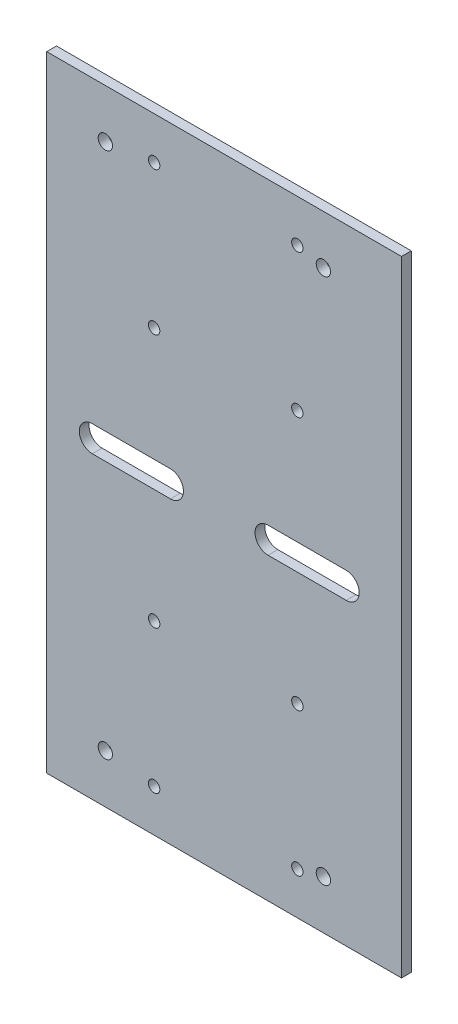
ISO-10303-21;
HEADER;
FILE_DESCRIPTION(('STEP AP214'),'2;1');
FILE_NAME('part.step','',(''),(''),'','','');
FILE_SCHEMA(('AUTOMOTIVE_DESIGN { 1 0 10303 214 1 1 1 1 }'));
ENDSEC;
DATA;
#1=APPLICATION_CONTEXT('core data for automotive mechanical design processes');
#2=APPLICATION_PROTOCOL_DEFINITION('international standard','automotive_design',2000,#1);
#3=PRODUCT_CONTEXT('',#1,'mechanical');
#4=PRODUCT('Part','Part','',(#3));
#5=PRODUCT_RELATED_PRODUCT_CATEGORY('part','',(#4));
#6=PRODUCT_DEFINITION_FORMATION('','',#4);
#7=PRODUCT_DEFINITION_CONTEXT('part definition',#1,'design');
#8=PRODUCT_DEFINITION('design','',#6,#7);
#9=PRODUCT_DEFINITION_SHAPE('','',#8);
#10=(LENGTH_UNIT() NAMED_UNIT(*) SI_UNIT(.MILLI.,.METRE.));
#11=(NAMED_UNIT(*) PLANE_ANGLE_UNIT() SI_UNIT($,.RADIAN.));
#12=(NAMED_UNIT(*) SI_UNIT($,.STERADIAN.) SOLID_ANGLE_UNIT());
#13=UNCERTAINTY_MEASURE_WITH_UNIT(LENGTH_MEASURE(1.E-05),#10,'distance_accuracy_value','');
#14=(GEOMETRIC_REPRESENTATION_CONTEXT(3) GLOBAL_UNCERTAINTY_ASSIGNED_CONTEXT((#13)) GLOBAL_UNIT_ASSIGNED_CONTEXT((#10,
#11,#12)) REPRESENTATION_CONTEXT('',''));
#15=CARTESIAN_POINT('',(0.,0.,0.));
#16=DIRECTION('',(0.,0.,1.));
#17=DIRECTION('',(1.,0.,0.));
#18=AXIS2_PLACEMENT_3D('',#15,#16,#17);
#19=CARTESIAN_POINT('',(0.,0.,3.));
#20=DIRECTION('',(0.,0.,1.));
#21=DIRECTION('',(1.,0.,0.));
#22=AXIS2_PLACEMENT_3D('',#19,#20,#21);
#23=PLANE('',#22);
#24=CARTESIAN_POINT('',(22.,-39.,3.));
#25=DIRECTION('',(0.,0.,1.));
#26=DIRECTION('',(1.,0.,0.));
#27=AXIS2_PLACEMENT_3D('',#24,#25,#26);
#28=CIRCLE('',#27,1.75);
#29=CARTESIAN_POINT('',(23.75,-39.,3.));
#30=VERTEX_POINT('',#29);
#31=EDGE_CURVE('E235',#30,#30,#28,.T.);
#32=ORIENTED_EDGE('',*,*,#31,.F.);
#33=EDGE_LOOP('',(#32));
#34=FACE_BOUND('',#33,.T.);
#35=CARTESIAN_POINT('',(22.,-83.,3.));
#36=DIRECTION('',(0.,0.,1.));
#37=DIRECTION('',(1.,0.,0.));
#38=AXIS2_PLACEMENT_3D('',#35,#36,#37);
#39=CIRCLE('',#38,1.75);
#40=CARTESIAN_POINT('',(23.75,-83.,3.));
#41=VERTEX_POINT('',#40);
#42=EDGE_CURVE('E251',#41,#41,#39,.T.);
#43=ORIENTED_EDGE('',*,*,#42,.F.);
#44=EDGE_LOOP('',(#43));
#45=FACE_BOUND('',#44,.T.);
#46=CARTESIAN_POINT('',(-22.,-39.,3.));
#47=DIRECTION('',(0.,0.,1.));
#48=DIRECTION('',(1.,0.,0.));
#49=AXIS2_PLACEMENT_3D('',#46,#47,#48);
#50=CIRCLE('',#49,1.75);
#51=CARTESIAN_POINT('',(-20.25,-39.,3.));
#52=VERTEX_POINT('',#51);
#53=EDGE_CURVE('E267',#52,#52,#50,.T.);
#54=ORIENTED_EDGE('',*,*,#53,.F.);
#55=EDGE_LOOP('',(#54));
#56=FACE_BOUND('',#55,.T.);
#57=CARTESIAN_POINT('',(-22.,-83.,3.));
#58=DIRECTION('',(0.,0.,1.));
#59=DIRECTION('',(1.,0.,0.));
#60=AXIS2_PLACEMENT_3D('',#57,#58,#59);
#61=CIRCLE('',#60,1.75);
#62=CARTESIAN_POINT('',(-20.25,-83.,3.));
#63=VERTEX_POINT('',#62);
#64=EDGE_CURVE('E283',#63,#63,#61,.T.);
#65=ORIENTED_EDGE('',*,*,#64,.F.);
#66=EDGE_LOOP('',(#65));
#67=FACE_BOUND('',#66,.T.);
#68=CARTESIAN_POINT('',(30.,-81.,3.));
#69=DIRECTION('',(0.,0.,1.));
#70=DIRECTION('',(1.,0.,0.));
#71=AXIS2_PLACEMENT_3D('',#68,#69,#70);
#72=CIRCLE('',#71,2.2);
#73=CARTESIAN_POINT('',(32.2,-81.,3.));
#74=VERTEX_POINT('',#73);
#75=EDGE_CURVE('E299',#74,#74,#72,.T.);
#76=ORIENTED_EDGE('',*,*,#75,.F.);
#77=EDGE_LOOP('',(#76));
#78=FACE_BOUND('',#77,.T.);
#79=CARTESIAN_POINT('',(-37.,-81.,3.));
#80=DIRECTION('',(0.,0.,1.));
#81=DIRECTION('',(1.,0.,0.));
#82=AXIS2_PLACEMENT_3D('',#79,#80,#81);
#83=CIRCLE('',#82,2.2);
#84=CARTESIAN_POINT('',(-34.8,-81.,3.));
#85=VERTEX_POINT('',#84);
#86=EDGE_CURVE('E315',#85,#85,#83,.T.);
#87=ORIENTED_EDGE('',*,*,#86,.F.);
#88=EDGE_LOOP('',(#87));
#89=FACE_BOUND('',#88,.T.);
#90=DIRECTION('',(0.,-1.,0.));
#91=VECTOR('',#90,1.);
#92=CARTESIAN_POINT('',(-55.,96.,3.));
#93=LINE('',#92,#91);
#94=CARTESIAN_POINT('',(-55.,96.,3.));
#95=VERTEX_POINT('',#94);
#96=CARTESIAN_POINT('',(-55.,-96.,3.));
#97=VERTEX_POINT('',#96);
#98=EDGE_CURVE('E323',#95,#97,#93,.T.);
#99=ORIENTED_EDGE('',*,*,#98,.T.);
#100=DIRECTION('',(1.,0.,0.));
#101=VECTOR('',#100,1.);
#102=CARTESIAN_POINT('',(-55.,-96.,3.));
#103=LINE('',#102,#101);
#104=CARTESIAN_POINT('',(54.,-96.,3.));
#105=VERTEX_POINT('',#104);
#106=EDGE_CURVE('E327',#97,#105,#103,.T.);
#107=ORIENTED_EDGE('',*,*,#106,.T.);
#108=DIRECTION('',(0.,1.,0.));
#109=VECTOR('',#108,1.);
#110=CARTESIAN_POINT('',(54.,-96.,3.));
#111=LINE('',#110,#109);
#112=CARTESIAN_POINT('',(54.,96.,3.));
#113=VERTEX_POINT('',#112);
#114=EDGE_CURVE('E331',#105,#113,#111,.T.);
#115=ORIENTED_EDGE('',*,*,#114,.T.);
#116=DIRECTION('',(-1.,0.,0.));
#117=VECTOR('',#116,1.);
#118=CARTESIAN_POINT('',(54.,96.,3.));
#119=LINE('',#118,#117);
#120=EDGE_CURVE('E334',#113,#95,#119,.T.);
#121=ORIENTED_EDGE('',*,*,#120,.T.);
#122=EDGE_LOOP('',(#99,#107,#115,#121));
#123=FACE_BOUND('',#122,.T.);
#124=CARTESIAN_POINT('',(-37.,81.,3.));
#125=DIRECTION('',(0.,0.,1.));
#126=DIRECTION('',(1.,0.,0.));
#127=AXIS2_PLACEMENT_3D('',#124,#125,#126);
#128=CIRCLE('',#127,2.2);
#129=CARTESIAN_POINT('',(-34.8,81.,3.));
#130=VERTEX_POINT('',#129);
#131=EDGE_CURVE('E307',#130,#130,#128,.T.);
#132=ORIENTED_EDGE('',*,*,#131,.F.);
#133=EDGE_LOOP('',(#132));
#134=FACE_BOUND('',#133,.T.);
#135=CARTESIAN_POINT('',(30.,81.,3.));
#136=DIRECTION('',(0.,0.,1.));
#137=DIRECTION('',(1.,0.,0.));
#138=AXIS2_PLACEMENT_3D('',#135,#136,#137);
#139=CIRCLE('',#138,2.2);
#140=CARTESIAN_POINT('',(32.2,81.,3.));
#141=VERTEX_POINT('',#140);
#142=EDGE_CURVE('E291',#141,#141,#139,.T.);
#143=ORIENTED_EDGE('',*,*,#142,.F.);
#144=EDGE_LOOP('',(#143));
#145=FACE_BOUND('',#144,.T.);
#146=CARTESIAN_POINT('',(-22.,39.,3.));
#147=DIRECTION('',(0.,0.,1.));
#148=DIRECTION('',(1.,0.,0.));
#149=AXIS2_PLACEMENT_3D('',#146,#147,#148);
#150=CIRCLE('',#149,1.75);
#151=CARTESIAN_POINT('',(-20.25,39.,3.));
#152=VERTEX_POINT('',#151);
#153=EDGE_CURVE('E275',#152,#152,#150,.T.);
#154=ORIENTED_EDGE('',*,*,#153,.F.);
#155=EDGE_LOOP('',(#154));
#156=FACE_BOUND('',#155,.T.);
#157=CARTESIAN_POINT('',(-22.,83.,3.));
#158=DIRECTION('',(0.,0.,1.));
#159=DIRECTION('',(1.,0.,0.));
#160=AXIS2_PLACEMENT_3D('',#157,#158,#159);
#161=CIRCLE('',#160,1.75);
#162=CARTESIAN_POINT('',(-20.25,83.,3.));
#163=VERTEX_POINT('',#162);
#164=EDGE_CURVE('E259',#163,#163,#161,.T.);
#165=ORIENTED_EDGE('',*,*,#164,.F.);
#166=EDGE_LOOP('',(#165));
#167=FACE_BOUND('',#166,.T.);
#168=CARTESIAN_POINT('',(22.,39.,3.));
#169=DIRECTION('',(0.,0.,1.));
#170=DIRECTION('',(1.,0.,0.));
#171=AXIS2_PLACEMENT_3D('',#168,#169,#170);
#172=CIRCLE('',#171,1.75);
#173=CARTESIAN_POINT('',(23.75,39.,3.));
#174=VERTEX_POINT('',#173);
#175=EDGE_CURVE('E243',#174,#174,#172,.T.);
#176=ORIENTED_EDGE('',*,*,#175,.F.);
#177=EDGE_LOOP('',(#176));
#178=FACE_BOUND('',#177,.T.);
#179=CARTESIAN_POINT('',(22.,83.,3.));
#180=DIRECTION('',(0.,0.,1.));
#181=DIRECTION('',(1.,0.,0.));
#182=AXIS2_PLACEMENT_3D('',#179,#180,#181);
#183=CIRCLE('',#182,1.75);
#184=CARTESIAN_POINT('',(23.75,83.,3.));
#185=VERTEX_POINT('',#184);
#186=EDGE_CURVE('E227',#185,#185,#183,.T.);
#187=ORIENTED_EDGE('',*,*,#186,.F.);
#188=EDGE_LOOP('',(#187));
#189=FACE_BOUND('',#188,.T.);
#190=DIRECTION('',(1.,0.,0.));
#191=VECTOR('',#190,1.);
#192=CARTESIAN_POINT('',(-41.,-4.,3.));
#193=LINE('',#192,#191);
#194=CARTESIAN_POINT('',(-41.,-4.,3.));
#195=VERTEX_POINT('',#194);
#196=CARTESIAN_POINT('',(-17.,-4.,3.));
#197=VERTEX_POINT('',#196);
#198=EDGE_CURVE('E187',#195,#197,#193,.T.);
#199=ORIENTED_EDGE('',*,*,#198,.F.);
#200=CARTESIAN_POINT('',(-41.,0.,3.));
#201=DIRECTION('',(0.,0.,1.));
#202=DIRECTION('',(1.,0.,0.));
#203=AXIS2_PLACEMENT_3D('',#200,#201,#202);
#204=CIRCLE('',#203,4.);
#205=CARTESIAN_POINT('',(-41.,4.,3.));
#206=VERTEX_POINT('',#205);
#207=EDGE_CURVE('E185',#206,#195,#204,.T.);
#208=ORIENTED_EDGE('',*,*,#207,.F.);
#209=DIRECTION('',(-1.,0.,0.));
#210=VECTOR('',#209,1.);
#211=CARTESIAN_POINT('',(-17.,4.,3.));
#212=LINE('',#211,#210);
#213=CARTESIAN_POINT('',(-17.,4.,3.));
#214=VERTEX_POINT('',#213);
#215=EDGE_CURVE('E195',#214,#206,#212,.T.);
#216=ORIENTED_EDGE('',*,*,#215,.F.);
#217=CARTESIAN_POINT('',(-17.,0.,3.));
#218=DIRECTION('',(0.,0.,1.));
#219=DIRECTION('',(1.,0.,0.));
#220=AXIS2_PLACEMENT_3D('',#217,#218,#219);
#221=CIRCLE('',#220,4.);
#222=EDGE_CURVE('E191',#197,#214,#221,.T.);
#223=ORIENTED_EDGE('',*,*,#222,.F.);
#224=EDGE_LOOP('',(#199,#208,#216,#223));
#225=FACE_BOUND('',#224,.T.);
#226=DIRECTION('',(1.,0.,0.));
#227=VECTOR('',#226,1.);
#228=CARTESIAN_POINT('',(13.,-4.,3.));
#229=LINE('',#228,#227);
#230=CARTESIAN_POINT('',(13.,-4.,3.));
#231=VERTEX_POINT('',#230);
#232=CARTESIAN_POINT('',(37.,-4.,3.));
#233=VERTEX_POINT('',#232);
#234=EDGE_CURVE('E144',#231,#233,#229,.T.);
#235=ORIENTED_EDGE('',*,*,#234,.F.);
#236=CARTESIAN_POINT('',(13.,0.,3.));
#237=DIRECTION('',(0.,0.,1.));
#238=DIRECTION('',(1.,0.,0.));
#239=AXIS2_PLACEMENT_3D('',#236,#237,#238);
#240=CIRCLE('',#239,4.);
#241=CARTESIAN_POINT('',(13.,4.,3.));
#242=VERTEX_POINT('',#241);
#243=EDGE_CURVE('E135',#242,#231,#240,.T.);
#244=ORIENTED_EDGE('',*,*,#243,.F.);
#245=DIRECTION('',(-1.,0.,0.));
#246=VECTOR('',#245,1.);
#247=CARTESIAN_POINT('',(37.,4.,3.));
#248=LINE('',#247,#246);
#249=CARTESIAN_POINT('',(37.,4.,3.));
#250=VERTEX_POINT('',#249);
#251=EDGE_CURVE('E163',#250,#242,#248,.T.);
#252=ORIENTED_EDGE('',*,*,#251,.F.);
#253=CARTESIAN_POINT('',(37.,0.,3.));
#254=DIRECTION('',(0.,0.,1.));
#255=DIRECTION('',(1.,0.,0.));
#256=AXIS2_PLACEMENT_3D('',#253,#254,#255);
#257=CIRCLE('',#256,4.);
#258=EDGE_CURVE('E157',#233,#250,#257,.T.);
#259=ORIENTED_EDGE('',*,*,#258,.F.);
#260=EDGE_LOOP('',(#235,#244,#252,#259));
#261=FACE_BOUND('',#260,.T.);
#262=ADVANCED_FACE('F45',(#34,#45,#56,#67,#78,#89,#123,#134,#145,#156,#167,#178,#189,#225,#261),
#23,.T.);
#263=CARTESIAN_POINT('',(0.,0.,0.));
#264=DIRECTION('',(0.,0.,1.));
#265=DIRECTION('',(1.,0.,0.));
#266=AXIS2_PLACEMENT_3D('',#263,#264,#265);
#267=PLANE('',#266);
#268=CARTESIAN_POINT('',(-41.,0.,0.));
#269=DIRECTION('',(0.,0.,1.));
#270=DIRECTION('',(1.,0.,0.));
#271=AXIS2_PLACEMENT_3D('',#268,#269,#270);
#272=CIRCLE('',#271,4.);
#273=CARTESIAN_POINT('',(-41.,4.,0.));
#274=VERTEX_POINT('',#273);
#275=CARTESIAN_POINT('',(-41.,-4.,0.));
#276=VERTEX_POINT('',#275);
#277=EDGE_CURVE('E153',#274,#276,#272,.T.);
#278=ORIENTED_EDGE('',*,*,#277,.T.);
#279=DIRECTION('',(1.,0.,0.));
#280=VECTOR('',#279,1.);
#281=CARTESIAN_POINT('',(-41.,-4.,0.));
#282=LINE('',#281,#280);
#283=CARTESIAN_POINT('',(-17.,-4.,0.));
#284=VERTEX_POINT('',#283);
#285=EDGE_CURVE('E202',#276,#284,#282,.T.);
#286=ORIENTED_EDGE('',*,*,#285,.T.);
#287=CARTESIAN_POINT('',(-17.,0.,0.));
#288=DIRECTION('',(0.,0.,1.));
#289=DIRECTION('',(1.,0.,0.));
#290=AXIS2_PLACEMENT_3D('',#287,#288,#289);
#291=CIRCLE('',#290,4.);
#292=CARTESIAN_POINT('',(-17.,4.,0.));
#293=VERTEX_POINT('',#292);
#294=EDGE_CURVE('E206',#284,#293,#291,.T.);
#295=ORIENTED_EDGE('',*,*,#294,.T.);
#296=DIRECTION('',(-1.,0.,0.));
#297=VECTOR('',#296,1.);
#298=CARTESIAN_POINT('',(-17.,4.,0.));
#299=LINE('',#298,#297);
#300=EDGE_CURVE('E188',#293,#274,#299,.T.);
#301=ORIENTED_EDGE('',*,*,#300,.T.);
#302=EDGE_LOOP('',(#278,#286,#295,#301));
#303=FACE_BOUND('',#302,.T.);
#304=DIRECTION('',(0.,-1.,0.));
#305=VECTOR('',#304,1.);
#306=CARTESIAN_POINT('',(-55.,96.,0.));
#307=LINE('',#306,#305);
#308=CARTESIAN_POINT('',(-55.,96.,0.));
#309=VERTEX_POINT('',#308);
#310=CARTESIAN_POINT('',(-55.,-96.,0.));
#311=VERTEX_POINT('',#310);
#312=EDGE_CURVE('E319',#309,#311,#307,.T.);
#313=ORIENTED_EDGE('',*,*,#312,.F.);
#314=DIRECTION('',(-1.,0.,0.));
#315=VECTOR('',#314,1.);
#316=CARTESIAN_POINT('',(54.,96.,0.));
#317=LINE('',#316,#315);
#318=CARTESIAN_POINT('',(54.,96.,0.));
#319=VERTEX_POINT('',#318);
#320=EDGE_CURVE('E328',#319,#309,#317,.T.);
#321=ORIENTED_EDGE('',*,*,#320,.F.);
#322=DIRECTION('',(0.,1.,0.));
#323=VECTOR('',#322,1.);
#324=CARTESIAN_POINT('',(54.,-96.,0.));
#325=LINE('',#324,#323);
#326=CARTESIAN_POINT('',(54.,-96.,0.));
#327=VERTEX_POINT('',#326);
#328=EDGE_CURVE('E344',#327,#319,#325,.T.);
#329=ORIENTED_EDGE('',*,*,#328,.F.);
#330=DIRECTION('',(1.,0.,0.));
#331=VECTOR('',#330,1.);
#332=CARTESIAN_POINT('',(-55.,-96.,0.));
#333=LINE('',#332,#331);
#334=EDGE_CURVE('E341',#311,#327,#333,.T.);
#335=ORIENTED_EDGE('',*,*,#334,.F.);
#336=EDGE_LOOP('',(#313,#321,#329,#335));
#337=FACE_BOUND('',#336,.T.);
#338=CARTESIAN_POINT('',(-37.,-81.,0.));
#339=DIRECTION('',(0.,0.,1.));
#340=DIRECTION('',(1.,0.,0.));
#341=AXIS2_PLACEMENT_3D('',#338,#339,#340);
#342=CIRCLE('',#341,2.2);
#343=CARTESIAN_POINT('',(-34.8,-81.,0.));
#344=VERTEX_POINT('',#343);
#345=EDGE_CURVE('E311',#344,#344,#342,.T.);
#346=ORIENTED_EDGE('',*,*,#345,.T.);
#347=EDGE_LOOP('',(#346));
#348=FACE_BOUND('',#347,.T.);
#349=CARTESIAN_POINT('',(-37.,81.,0.));
#350=DIRECTION('',(0.,0.,1.));
#351=DIRECTION('',(1.,0.,0.));
#352=AXIS2_PLACEMENT_3D('',#349,#350,#351);
#353=CIRCLE('',#352,2.2);
#354=CARTESIAN_POINT('',(-34.8,81.,0.));
#355=VERTEX_POINT('',#354);
#356=EDGE_CURVE('E303',#355,#355,#353,.T.);
#357=ORIENTED_EDGE('',*,*,#356,.T.);
#358=EDGE_LOOP('',(#357));
#359=FACE_BOUND('',#358,.T.);
#360=CARTESIAN_POINT('',(30.,-81.,0.));
#361=DIRECTION('',(0.,0.,1.));
#362=DIRECTION('',(1.,0.,0.));
#363=AXIS2_PLACEMENT_3D('',#360,#361,#362);
#364=CIRCLE('',#363,2.2);
#365=CARTESIAN_POINT('',(32.2,-81.,0.));
#366=VERTEX_POINT('',#365);
#367=EDGE_CURVE('E295',#366,#366,#364,.T.);
#368=ORIENTED_EDGE('',*,*,#367,.T.);
#369=EDGE_LOOP('',(#368));
#370=FACE_BOUND('',#369,.T.);
#371=CARTESIAN_POINT('',(30.,81.,0.));
#372=DIRECTION('',(0.,0.,1.));
#373=DIRECTION('',(1.,0.,0.));
#374=AXIS2_PLACEMENT_3D('',#371,#372,#373);
#375=CIRCLE('',#374,2.2);
#376=CARTESIAN_POINT('',(32.2,81.,0.));
#377=VERTEX_POINT('',#376);
#378=EDGE_CURVE('E287',#377,#377,#375,.T.);
#379=ORIENTED_EDGE('',*,*,#378,.T.);
#380=EDGE_LOOP('',(#379));
#381=FACE_BOUND('',#380,.T.);
#382=CARTESIAN_POINT('',(-22.,-83.,0.));
#383=DIRECTION('',(0.,0.,1.));
#384=DIRECTION('',(1.,0.,0.));
#385=AXIS2_PLACEMENT_3D('',#382,#383,#384);
#386=CIRCLE('',#385,1.75);
#387=CARTESIAN_POINT('',(-20.25,-83.,0.));
#388=VERTEX_POINT('',#387);
#389=EDGE_CURVE('E279',#388,#388,#386,.T.);
#390=ORIENTED_EDGE('',*,*,#389,.T.);
#391=EDGE_LOOP('',(#390));
#392=FACE_BOUND('',#391,.T.);
#393=CARTESIAN_POINT('',(-22.,39.,0.));
#394=DIRECTION('',(0.,0.,1.));
#395=DIRECTION('',(1.,0.,0.));
#396=AXIS2_PLACEMENT_3D('',#393,#394,#395);
#397=CIRCLE('',#396,1.75);
#398=CARTESIAN_POINT('',(-20.25,39.,0.));
#399=VERTEX_POINT('',#398);
#400=EDGE_CURVE('E271',#399,#399,#397,.T.);
#401=ORIENTED_EDGE('',*,*,#400,.T.);
#402=EDGE_LOOP('',(#401));
#403=FACE_BOUND('',#402,.T.);
#404=CARTESIAN_POINT('',(-22.,-39.,0.));
#405=DIRECTION('',(0.,0.,1.));
#406=DIRECTION('',(1.,0.,0.));
#407=AXIS2_PLACEMENT_3D('',#404,#405,#406);
#408=CIRCLE('',#407,1.75);
#409=CARTESIAN_POINT('',(-20.25,-39.,0.));
#410=VERTEX_POINT('',#409);
#411=EDGE_CURVE('E263',#410,#410,#408,.T.);
#412=ORIENTED_EDGE('',*,*,#411,.T.);
#413=EDGE_LOOP('',(#412));
#414=FACE_BOUND('',#413,.T.);
#415=CARTESIAN_POINT('',(-22.,83.,0.));
#416=DIRECTION('',(0.,0.,1.));
#417=DIRECTION('',(1.,0.,0.));
#418=AXIS2_PLACEMENT_3D('',#415,#416,#417);
#419=CIRCLE('',#418,1.75);
#420=CARTESIAN_POINT('',(-20.25,83.,0.));
#421=VERTEX_POINT('',#420);
#422=EDGE_CURVE('E255',#421,#421,#419,.T.);
#423=ORIENTED_EDGE('',*,*,#422,.T.);
#424=EDGE_LOOP('',(#423));
#425=FACE_BOUND('',#424,.T.);
#426=CARTESIAN_POINT('',(22.,-83.,0.));
#427=DIRECTION('',(0.,0.,1.));
#428=DIRECTION('',(1.,0.,0.));
#429=AXIS2_PLACEMENT_3D('',#426,#427,#428);
#430=CIRCLE('',#429,1.75);
#431=CARTESIAN_POINT('',(23.75,-83.,0.));
#432=VERTEX_POINT('',#431);
#433=EDGE_CURVE('E247',#432,#432,#430,.T.);
#434=ORIENTED_EDGE('',*,*,#433,.T.);
#435=EDGE_LOOP('',(#434));
#436=FACE_BOUND('',#435,.T.);
#437=CARTESIAN_POINT('',(22.,39.,0.));
#438=DIRECTION('',(0.,0.,1.));
#439=DIRECTION('',(1.,0.,0.));
#440=AXIS2_PLACEMENT_3D('',#437,#438,#439);
#441=CIRCLE('',#440,1.75);
#442=CARTESIAN_POINT('',(23.75,39.,0.));
#443=VERTEX_POINT('',#442);
#444=EDGE_CURVE('E239',#443,#443,#441,.T.);
#445=ORIENTED_EDGE('',*,*,#444,.T.);
#446=EDGE_LOOP('',(#445));
#447=FACE_BOUND('',#446,.T.);
#448=CARTESIAN_POINT('',(22.,-39.,0.));
#449=DIRECTION('',(0.,0.,1.));
#450=DIRECTION('',(1.,0.,0.));
#451=AXIS2_PLACEMENT_3D('',#448,#449,#450);
#452=CIRCLE('',#451,1.75);
#453=CARTESIAN_POINT('',(23.75,-39.,0.));
#454=VERTEX_POINT('',#453);
#455=EDGE_CURVE('E231',#454,#454,#452,.T.);
#456=ORIENTED_EDGE('',*,*,#455,.T.);
#457=EDGE_LOOP('',(#456));
#458=FACE_BOUND('',#457,.T.);
#459=CARTESIAN_POINT('',(22.,83.,0.));
#460=DIRECTION('',(0.,0.,1.));
#461=DIRECTION('',(1.,0.,0.));
#462=AXIS2_PLACEMENT_3D('',#459,#460,#461);
#463=CIRCLE('',#462,1.75);
#464=CARTESIAN_POINT('',(23.75,83.,0.));
#465=VERTEX_POINT('',#464);
#466=EDGE_CURVE('E226',#465,#465,#463,.T.);
#467=ORIENTED_EDGE('',*,*,#466,.T.);
#468=EDGE_LOOP('',(#467));
#469=FACE_BOUND('',#468,.T.);
#470=CARTESIAN_POINT('',(13.,0.,0.));
#471=DIRECTION('',(0.,0.,1.));
#472=DIRECTION('',(1.,0.,0.));
#473=AXIS2_PLACEMENT_3D('',#470,#471,#472);
#474=CIRCLE('',#473,4.);
#475=CARTESIAN_POINT('',(13.,4.,0.));
#476=VERTEX_POINT('',#475);
#477=CARTESIAN_POINT('',(13.,-4.,0.));
#478=VERTEX_POINT('',#477);
#479=EDGE_CURVE('E69',#476,#478,#474,.T.);
#480=ORIENTED_EDGE('',*,*,#479,.T.);
#481=DIRECTION('',(1.,0.,0.));
#482=VECTOR('',#481,1.);
#483=CARTESIAN_POINT('',(13.,-4.,0.));
#484=LINE('',#483,#482);
#485=CARTESIAN_POINT('',(37.,-4.,0.));
#486=VERTEX_POINT('',#485);
#487=EDGE_CURVE('E151',#478,#486,#484,.T.);
#488=ORIENTED_EDGE('',*,*,#487,.T.);
#489=CARTESIAN_POINT('',(37.,0.,0.));
#490=DIRECTION('',(0.,0.,1.));
#491=DIRECTION('',(1.,0.,0.));
#492=AXIS2_PLACEMENT_3D('',#489,#490,#491);
#493=CIRCLE('',#492,4.);
#494=CARTESIAN_POINT('',(37.,4.,0.));
#495=VERTEX_POINT('',#494);
#496=EDGE_CURVE('E172',#486,#495,#493,.T.);
#497=ORIENTED_EDGE('',*,*,#496,.T.);
#498=DIRECTION('',(-1.,0.,0.));
#499=VECTOR('',#498,1.);
#500=CARTESIAN_POINT('',(37.,4.,0.));
#501=LINE('',#500,#499);
#502=EDGE_CURVE('E145',#495,#476,#501,.T.);
#503=ORIENTED_EDGE('',*,*,#502,.T.);
#504=EDGE_LOOP('',(#480,#488,#497,#503));
#505=FACE_BOUND('',#504,.T.);
#506=ADVANCED_FACE('F366',(#303,#337,#348,#359,#370,#381,#392,#403,#414,#425,#436,#447,#458,
#469,#505),#267,.F.);
#507=CARTESIAN_POINT('',(-55.,96.,3.));
#508=DIRECTION('',(1.,0.,0.));
#509=DIRECTION('',(0.,0.,-1.));
#510=AXIS2_PLACEMENT_3D('',#507,#508,#509);
#511=PLANE('',#510);
#512=ORIENTED_EDGE('',*,*,#312,.T.);
#513=DIRECTION('',(0.,0.,-1.));
#514=VECTOR('',#513,1.);
#515=CARTESIAN_POINT('',(-55.,-96.,3.));
#516=LINE('',#515,#514);
#517=EDGE_CURVE('E11',#97,#311,#516,.T.);
#518=ORIENTED_EDGE('',*,*,#517,.F.);
#519=ORIENTED_EDGE('',*,*,#98,.F.);
#520=DIRECTION('',(0.,0.,-1.));
#521=VECTOR('',#520,1.);
#522=CARTESIAN_POINT('',(-55.,96.,3.));
#523=LINE('',#522,#521);
#524=EDGE_CURVE('E337',#95,#309,#523,.T.);
#525=ORIENTED_EDGE('',*,*,#524,.T.);
#526=EDGE_LOOP('',(#512,#518,#519,#525));
#527=FACE_BOUND('',#526,.T.);
#528=ADVANCED_FACE('F47',(#527),#511,.F.);
#529=CARTESIAN_POINT('',(-55.,-96.,3.));
#530=DIRECTION('',(0.,1.,0.));
#531=DIRECTION('',(0.,0.,1.));
#532=AXIS2_PLACEMENT_3D('',#529,#530,#531);
#533=PLANE('',#532);
#534=ORIENTED_EDGE('',*,*,#334,.T.);
#535=DIRECTION('',(0.,0.,-1.));
#536=VECTOR('',#535,1.);
#537=CARTESIAN_POINT('',(54.,-96.,3.));
#538=LINE('',#537,#536);
#539=EDGE_CURVE('E54',#105,#327,#538,.T.);
#540=ORIENTED_EDGE('',*,*,#539,.F.);
#541=ORIENTED_EDGE('',*,*,#106,.F.);
#542=ORIENTED_EDGE('',*,*,#517,.T.);
#543=EDGE_LOOP('',(#534,#540,#541,#542));
#544=FACE_BOUND('',#543,.T.);
#545=ADVANCED_FACE('F377',(#544),#533,.F.);
#546=CARTESIAN_POINT('',(54.,-96.,3.));
#547=DIRECTION('',(-1.,0.,0.));
#548=DIRECTION('',(0.,0.,1.));
#549=AXIS2_PLACEMENT_3D('',#546,#547,#548);
#550=PLANE('',#549);
#551=ORIENTED_EDGE('',*,*,#328,.T.);
#552=DIRECTION('',(0.,0.,-1.));
#553=VECTOR('',#552,1.);
#554=CARTESIAN_POINT('',(54.,96.,3.));
#555=LINE('',#554,#553);
#556=EDGE_CURVE('E351',#113,#319,#555,.T.);
#557=ORIENTED_EDGE('',*,*,#556,.F.);
#558=ORIENTED_EDGE('',*,*,#114,.F.);
#559=ORIENTED_EDGE('',*,*,#539,.T.);
#560=EDGE_LOOP('',(#551,#557,#558,#559));
#561=FACE_BOUND('',#560,.T.);
#562=ADVANCED_FACE('F360',(#561),#550,.F.);
#563=CARTESIAN_POINT('',(54.,96.,3.));
#564=DIRECTION('',(0.,-1.,0.));
#565=DIRECTION('',(0.,0.,-1.));
#566=AXIS2_PLACEMENT_3D('',#563,#564,#565);
#567=PLANE('',#566);
#568=ORIENTED_EDGE('',*,*,#320,.T.);
#569=ORIENTED_EDGE('',*,*,#524,.F.);
#570=ORIENTED_EDGE('',*,*,#120,.F.);
#571=ORIENTED_EDGE('',*,*,#556,.T.);
#572=EDGE_LOOP('',(#568,#569,#570,#571));
#573=FACE_BOUND('',#572,.T.);
#574=ADVANCED_FACE('F370',(#573),#567,.F.);
#575=CARTESIAN_POINT('',(-37.,-81.,3.));
#576=DIRECTION('',(0.,0.,-1.));
#577=DIRECTION('',(-1.,0.,0.));
#578=AXIS2_PLACEMENT_3D('',#575,#576,#577);
#579=CYLINDRICAL_SURFACE('',#578,2.2);
#580=ORIENTED_EDGE('',*,*,#86,.T.);
#581=EDGE_LOOP('',(#580));
#582=FACE_BOUND('',#581,.T.);
#583=ORIENTED_EDGE('',*,*,#345,.F.);
#584=EDGE_LOOP('',(#583));
#585=FACE_BOUND('',#584,.T.);
#586=ADVANCED_FACE('F393',(#582,#585),#579,.F.);
#587=CARTESIAN_POINT('',(-37.,81.,3.));
#588=DIRECTION('',(0.,0.,-1.));
#589=DIRECTION('',(-1.,0.,0.));
#590=AXIS2_PLACEMENT_3D('',#587,#588,#589);
#591=CYLINDRICAL_SURFACE('',#590,2.2);
#592=ORIENTED_EDGE('',*,*,#131,.T.);
#593=EDGE_LOOP('',(#592));
#594=FACE_BOUND('',#593,.T.);
#595=ORIENTED_EDGE('',*,*,#356,.F.);
#596=EDGE_LOOP('',(#595));
#597=FACE_BOUND('',#596,.T.);
#598=ADVANCED_FACE('F399',(#594,#597),#591,.F.);
#599=CARTESIAN_POINT('',(30.,-81.,3.));
#600=DIRECTION('',(0.,0.,-1.));
#601=DIRECTION('',(-1.,0.,0.));
#602=AXIS2_PLACEMENT_3D('',#599,#600,#601);
#603=CYLINDRICAL_SURFACE('',#602,2.2);
#604=ORIENTED_EDGE('',*,*,#75,.T.);
#605=EDGE_LOOP('',(#604));
#606=FACE_BOUND('',#605,.T.);
#607=ORIENTED_EDGE('',*,*,#367,.F.);
#608=EDGE_LOOP('',(#607));
#609=FACE_BOUND('',#608,.T.);
#610=ADVANCED_FACE('F403',(#606,#609),#603,.F.);
#611=CARTESIAN_POINT('',(30.,81.,3.));
#612=DIRECTION('',(0.,0.,-1.));
#613=DIRECTION('',(-1.,0.,0.));
#614=AXIS2_PLACEMENT_3D('',#611,#612,#613);
#615=CYLINDRICAL_SURFACE('',#614,2.2);
#616=ORIENTED_EDGE('',*,*,#142,.T.);
#617=EDGE_LOOP('',(#616));
#618=FACE_BOUND('',#617,.T.);
#619=ORIENTED_EDGE('',*,*,#378,.F.);
#620=EDGE_LOOP('',(#619));
#621=FACE_BOUND('',#620,.T.);
#622=ADVANCED_FACE('F492',(#618,#621),#615,.F.);
#623=CARTESIAN_POINT('',(-22.,-83.,3.));
#624=DIRECTION('',(0.,0.,-1.));
#625=DIRECTION('',(-1.,0.,0.));
#626=AXIS2_PLACEMENT_3D('',#623,#624,#625);
#627=CYLINDRICAL_SURFACE('',#626,1.75);
#628=ORIENTED_EDGE('',*,*,#64,.T.);
#629=EDGE_LOOP('',(#628));
#630=FACE_BOUND('',#629,.T.);
#631=ORIENTED_EDGE('',*,*,#389,.F.);
#632=EDGE_LOOP('',(#631));
#633=FACE_BOUND('',#632,.T.);
#634=ADVANCED_FACE('F488',(#630,#633),#627,.F.);
#635=CARTESIAN_POINT('',(-22.,39.,3.));
#636=DIRECTION('',(0.,0.,-1.));
#637=DIRECTION('',(-1.,0.,0.));
#638=AXIS2_PLACEMENT_3D('',#635,#636,#637);
#639=CYLINDRICAL_SURFACE('',#638,1.75);
#640=ORIENTED_EDGE('',*,*,#153,.T.);
#641=EDGE_LOOP('',(#640));
#642=FACE_BOUND('',#641,.T.);
#643=ORIENTED_EDGE('',*,*,#400,.F.);
#644=EDGE_LOOP('',(#643));
#645=FACE_BOUND('',#644,.T.);
#646=ADVANCED_FACE('F484',(#642,#645),#639,.F.);
#647=CARTESIAN_POINT('',(-22.,-39.,3.));
#648=DIRECTION('',(0.,0.,-1.));
#649=DIRECTION('',(-1.,0.,0.));
#650=AXIS2_PLACEMENT_3D('',#647,#648,#649);
#651=CYLINDRICAL_SURFACE('',#650,1.75);
#652=ORIENTED_EDGE('',*,*,#53,.T.);
#653=EDGE_LOOP('',(#652));
#654=FACE_BOUND('',#653,.T.);
#655=ORIENTED_EDGE('',*,*,#411,.F.);
#656=EDGE_LOOP('',(#655));
#657=FACE_BOUND('',#656,.T.);
#658=ADVANCED_FACE('F480',(#654,#657),#651,.F.);
#659=CARTESIAN_POINT('',(-22.,83.,3.));
#660=DIRECTION('',(0.,0.,-1.));
#661=DIRECTION('',(-1.,0.,0.));
#662=AXIS2_PLACEMENT_3D('',#659,#660,#661);
#663=CYLINDRICAL_SURFACE('',#662,1.75);
#664=ORIENTED_EDGE('',*,*,#164,.T.);
#665=EDGE_LOOP('',(#664));
#666=FACE_BOUND('',#665,.T.);
#667=ORIENTED_EDGE('',*,*,#422,.F.);
#668=EDGE_LOOP('',(#667));
#669=FACE_BOUND('',#668,.T.);
#670=ADVANCED_FACE('F476',(#666,#669),#663,.F.);
#671=CARTESIAN_POINT('',(22.,-83.,3.));
#672=DIRECTION('',(0.,0.,-1.));
#673=DIRECTION('',(-1.,0.,0.));
#674=AXIS2_PLACEMENT_3D('',#671,#672,#673);
#675=CYLINDRICAL_SURFACE('',#674,1.75);
#676=ORIENTED_EDGE('',*,*,#42,.T.);
#677=EDGE_LOOP('',(#676));
#678=FACE_BOUND('',#677,.T.);
#679=ORIENTED_EDGE('',*,*,#433,.F.);
#680=EDGE_LOOP('',(#679));
#681=FACE_BOUND('',#680,.T.);
#682=ADVANCED_FACE('F472',(#678,#681),#675,.F.);
#683=CARTESIAN_POINT('',(22.,39.,3.));
#684=DIRECTION('',(0.,0.,-1.));
#685=DIRECTION('',(-1.,0.,0.));
#686=AXIS2_PLACEMENT_3D('',#683,#684,#685);
#687=CYLINDRICAL_SURFACE('',#686,1.75);
#688=ORIENTED_EDGE('',*,*,#175,.T.);
#689=EDGE_LOOP('',(#688));
#690=FACE_BOUND('',#689,.T.);
#691=ORIENTED_EDGE('',*,*,#444,.F.);
#692=EDGE_LOOP('',(#691));
#693=FACE_BOUND('',#692,.T.);
#694=ADVANCED_FACE('F468',(#690,#693),#687,.F.);
#695=CARTESIAN_POINT('',(22.,-39.,3.));
#696=DIRECTION('',(0.,0.,-1.));
#697=DIRECTION('',(-1.,0.,0.));
#698=AXIS2_PLACEMENT_3D('',#695,#696,#697);
#699=CYLINDRICAL_SURFACE('',#698,1.75);
#700=ORIENTED_EDGE('',*,*,#31,.T.);
#701=EDGE_LOOP('',(#700));
#702=FACE_BOUND('',#701,.T.);
#703=ORIENTED_EDGE('',*,*,#455,.F.);
#704=EDGE_LOOP('',(#703));
#705=FACE_BOUND('',#704,.T.);
#706=ADVANCED_FACE('F464',(#702,#705),#699,.F.);
#707=CARTESIAN_POINT('',(22.,83.,3.));
#708=DIRECTION('',(0.,0.,-1.));
#709=DIRECTION('',(-1.,0.,0.));
#710=AXIS2_PLACEMENT_3D('',#707,#708,#709);
#711=CYLINDRICAL_SURFACE('',#710,1.75);
#712=ORIENTED_EDGE('',*,*,#186,.T.);
#713=EDGE_LOOP('',(#712));
#714=FACE_BOUND('',#713,.T.);
#715=ORIENTED_EDGE('',*,*,#466,.F.);
#716=EDGE_LOOP('',(#715));
#717=FACE_BOUND('',#716,.T.);
#718=ADVANCED_FACE('F460',(#714,#717),#711,.F.);
#719=CARTESIAN_POINT('',(-41.,0.,3.));
#720=DIRECTION('',(0.,0.,-1.));
#721=DIRECTION('',(-1.,0.,0.));
#722=AXIS2_PLACEMENT_3D('',#719,#720,#721);
#723=CYLINDRICAL_SURFACE('',#722,4.);
#724=ORIENTED_EDGE('',*,*,#277,.F.);
#725=DIRECTION('',(0.,0.,-1.));
#726=VECTOR('',#725,1.);
#727=CARTESIAN_POINT('',(-41.,4.,3.));
#728=LINE('',#727,#726);
#729=EDGE_CURVE('E198',#206,#274,#728,.T.);
#730=ORIENTED_EDGE('',*,*,#729,.F.);
#731=ORIENTED_EDGE('',*,*,#207,.T.);
#732=DIRECTION('',(0.,0.,-1.));
#733=VECTOR('',#732,1.);
#734=CARTESIAN_POINT('',(-41.,-4.,3.));
#735=LINE('',#734,#733);
#736=EDGE_CURVE('E222',#195,#276,#735,.T.);
#737=ORIENTED_EDGE('',*,*,#736,.T.);
#738=EDGE_LOOP('',(#724,#730,#731,#737));
#739=FACE_BOUND('',#738,.T.);
#740=ADVANCED_FACE('F456',(#739),#723,.F.);
#741=CARTESIAN_POINT('',(-41.,-4.,3.));
#742=DIRECTION('',(0.,1.,0.));
#743=DIRECTION('',(0.,0.,1.));
#744=AXIS2_PLACEMENT_3D('',#741,#742,#743);
#745=PLANE('',#744);
#746=ORIENTED_EDGE('',*,*,#285,.F.);
#747=ORIENTED_EDGE('',*,*,#736,.F.);
#748=ORIENTED_EDGE('',*,*,#198,.T.);
#749=DIRECTION('',(0.,0.,-1.));
#750=VECTOR('',#749,1.);
#751=CARTESIAN_POINT('',(-17.,-4.,3.));
#752=LINE('',#751,#750);
#753=EDGE_CURVE('E219',#197,#284,#752,.T.);
#754=ORIENTED_EDGE('',*,*,#753,.T.);
#755=EDGE_LOOP('',(#746,#747,#748,#754));
#756=FACE_BOUND('',#755,.T.);
#757=ADVANCED_FACE('F452',(#756),#745,.T.);
#758=CARTESIAN_POINT('',(-17.,0.,3.));
#759=DIRECTION('',(0.,0.,-1.));
#760=DIRECTION('',(-1.,0.,0.));
#761=AXIS2_PLACEMENT_3D('',#758,#759,#760);
#762=CYLINDRICAL_SURFACE('',#761,4.);
#763=ORIENTED_EDGE('',*,*,#294,.F.);
#764=ORIENTED_EDGE('',*,*,#753,.F.);
#765=ORIENTED_EDGE('',*,*,#222,.T.);
#766=DIRECTION('',(0.,0.,-1.));
#767=VECTOR('',#766,1.);
#768=CARTESIAN_POINT('',(-17.,4.,3.));
#769=LINE('',#768,#767);
#770=EDGE_CURVE('E216',#214,#293,#769,.T.);
#771=ORIENTED_EDGE('',*,*,#770,.T.);
#772=EDGE_LOOP('',(#763,#764,#765,#771));
#773=FACE_BOUND('',#772,.T.);
#774=ADVANCED_FACE('F448',(#773),#762,.F.);
#775=CARTESIAN_POINT('',(-17.,4.,3.));
#776=DIRECTION('',(0.,-1.,0.));
#777=DIRECTION('',(0.,0.,-1.));
#778=AXIS2_PLACEMENT_3D('',#775,#776,#777);
#779=PLANE('',#778);
#780=ORIENTED_EDGE('',*,*,#300,.F.);
#781=ORIENTED_EDGE('',*,*,#770,.F.);
#782=ORIENTED_EDGE('',*,*,#215,.T.);
#783=ORIENTED_EDGE('',*,*,#729,.T.);
#784=EDGE_LOOP('',(#780,#781,#782,#783));
#785=FACE_BOUND('',#784,.T.);
#786=ADVANCED_FACE('F445',(#785),#779,.T.);
#787=CARTESIAN_POINT('',(13.,0.,3.));
#788=DIRECTION('',(0.,0.,-1.));
#789=DIRECTION('',(-1.,0.,0.));
#790=AXIS2_PLACEMENT_3D('',#787,#788,#789);
#791=CYLINDRICAL_SURFACE('',#790,4.);
#792=ORIENTED_EDGE('',*,*,#479,.F.);
#793=DIRECTION('',(0.,0.,-1.));
#794=VECTOR('',#793,1.);
#795=CARTESIAN_POINT('',(13.,4.,3.));
#796=LINE('',#795,#794);
#797=EDGE_CURVE('E139',#242,#476,#796,.T.);
#798=ORIENTED_EDGE('',*,*,#797,.F.);
#799=ORIENTED_EDGE('',*,*,#243,.T.);
#800=DIRECTION('',(0.,0.,-1.));
#801=VECTOR('',#800,1.);
#802=CARTESIAN_POINT('',(13.,-4.,3.));
#803=LINE('',#802,#801);
#804=EDGE_CURVE('E138',#231,#478,#803,.T.);
#805=ORIENTED_EDGE('',*,*,#804,.T.);
#806=EDGE_LOOP('',(#792,#798,#799,#805));
#807=FACE_BOUND('',#806,.T.);
#808=ADVANCED_FACE('F137',(#807),#791,.F.);
#809=CARTESIAN_POINT('',(13.,-4.,3.));
#810=DIRECTION('',(0.,1.,0.));
#811=DIRECTION('',(0.,0.,1.));
#812=AXIS2_PLACEMENT_3D('',#809,#810,#811);
#813=PLANE('',#812);
#814=ORIENTED_EDGE('',*,*,#487,.F.);
#815=ORIENTED_EDGE('',*,*,#804,.F.);
#816=ORIENTED_EDGE('',*,*,#234,.T.);
#817=DIRECTION('',(0.,0.,-1.));
#818=VECTOR('',#817,1.);
#819=CARTESIAN_POINT('',(37.,-4.,3.));
#820=LINE('',#819,#818);
#821=EDGE_CURVE('E154',#233,#486,#820,.T.);
#822=ORIENTED_EDGE('',*,*,#821,.T.);
#823=EDGE_LOOP('',(#814,#815,#816,#822));
#824=FACE_BOUND('',#823,.T.);
#825=ADVANCED_FACE('F148',(#824),#813,.T.);
#826=CARTESIAN_POINT('',(37.,0.,3.));
#827=DIRECTION('',(0.,0.,-1.));
#828=DIRECTION('',(-1.,0.,0.));
#829=AXIS2_PLACEMENT_3D('',#826,#827,#828);
#830=CYLINDRICAL_SURFACE('',#829,4.);
#831=ORIENTED_EDGE('',*,*,#496,.F.);
#832=ORIENTED_EDGE('',*,*,#821,.F.);
#833=ORIENTED_EDGE('',*,*,#258,.T.);
#834=DIRECTION('',(0.,0.,-1.));
#835=VECTOR('',#834,1.);
#836=CARTESIAN_POINT('',(37.,4.,3.));
#837=LINE('',#836,#835);
#838=EDGE_CURVE('E61',#250,#495,#837,.T.);
#839=ORIENTED_EDGE('',*,*,#838,.T.);
#840=EDGE_LOOP('',(#831,#832,#833,#839));
#841=FACE_BOUND('',#840,.T.);
#842=ADVANCED_FACE('F434',(#841),#830,.F.);
#843=CARTESIAN_POINT('',(37.,4.,3.));
#844=DIRECTION('',(0.,-1.,0.));
#845=DIRECTION('',(0.,0.,-1.));
#846=AXIS2_PLACEMENT_3D('',#843,#844,#845);
#847=PLANE('',#846);
#848=ORIENTED_EDGE('',*,*,#502,.F.);
#849=ORIENTED_EDGE('',*,*,#838,.F.);
#850=ORIENTED_EDGE('',*,*,#251,.T.);
#851=ORIENTED_EDGE('',*,*,#797,.T.);
#852=EDGE_LOOP('',(#848,#849,#850,#851));
#853=FACE_BOUND('',#852,.T.);
#854=ADVANCED_FACE('F432',(#853),#847,.T.);
#855=CLOSED_SHELL('',(#262,#506,#528,#545,#562,#574,#586,#598,#610,#622,#634,#646,#658,#670,
#682,#694,#706,#718,#740,#757,#774,#786,#808,#825,#842,#854));
#856=MANIFOLD_SOLID_BREP('B2',#855);
#857=ADVANCED_BREP_SHAPE_REPRESENTATION('',(#18,#856),#14);
#858=SHAPE_DEFINITION_REPRESENTATION(#9,#857);
ENDSEC;
END-ISO-10303-21;
